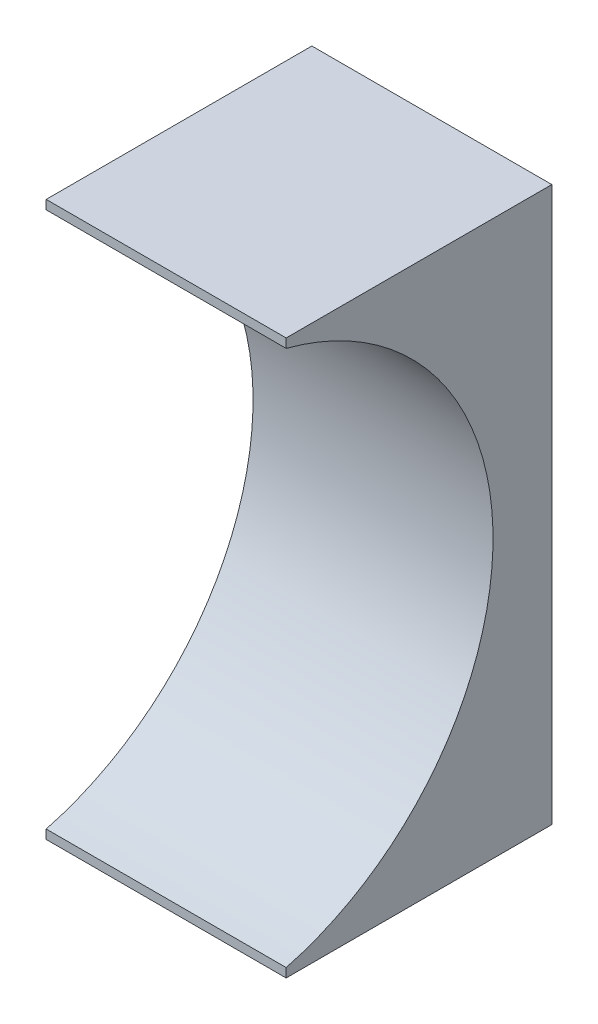
ISO-10303-21;
HEADER;
FILE_DESCRIPTION(('STEP AP214'),'2;1');
FILE_NAME('part.step','',(''),(''),'','','');
FILE_SCHEMA(('AUTOMOTIVE_DESIGN { 1 0 10303 214 1 1 1 1 }'));
ENDSEC;
DATA;
#1=APPLICATION_CONTEXT('core data for automotive mechanical design processes');
#2=APPLICATION_PROTOCOL_DEFINITION('international standard','automotive_design',2000,#1);
#3=PRODUCT_CONTEXT('',#1,'mechanical');
#4=PRODUCT('Part','Part','',(#3));
#5=PRODUCT_RELATED_PRODUCT_CATEGORY('part','',(#4));
#6=PRODUCT_DEFINITION_FORMATION('','',#4);
#7=PRODUCT_DEFINITION_CONTEXT('part definition',#1,'design');
#8=PRODUCT_DEFINITION('design','',#6,#7);
#9=PRODUCT_DEFINITION_SHAPE('','',#8);
#10=(LENGTH_UNIT() NAMED_UNIT(*) SI_UNIT(.MILLI.,.METRE.));
#11=(NAMED_UNIT(*) PLANE_ANGLE_UNIT() SI_UNIT($,.RADIAN.));
#12=(NAMED_UNIT(*) SI_UNIT($,.STERADIAN.) SOLID_ANGLE_UNIT());
#13=UNCERTAINTY_MEASURE_WITH_UNIT(LENGTH_MEASURE(1.E-05),#10,'distance_accuracy_value','');
#14=(GEOMETRIC_REPRESENTATION_CONTEXT(3) GLOBAL_UNCERTAINTY_ASSIGNED_CONTEXT((#13)) GLOBAL_UNIT_ASSIGNED_CONTEXT((#10,
#11,#12)) REPRESENTATION_CONTEXT('',''));
#15=CARTESIAN_POINT('',(0.,0.,0.));
#16=DIRECTION('',(0.,0.,1.));
#17=DIRECTION('',(1.,0.,0.));
#18=AXIS2_PLACEMENT_3D('',#15,#16,#17);
#19=CARTESIAN_POINT('',(20.,0.,0.));
#20=DIRECTION('',(-1.,0.,0.));
#21=DIRECTION('',(0.,0.,1.));
#22=AXIS2_PLACEMENT_3D('',#19,#20,#21);
#23=CYLINDRICAL_SURFACE('',#22,23.1);
#24=DIRECTION('',(-1.,0.,0.));
#25=VECTOR('',#24,1.);
#26=CARTESIAN_POINT('',(20.,22.345151804564,-5.85697796060321));
#27=LINE('',#26,#25);
#28=CARTESIAN_POINT('',(0.,22.345151804564,-5.85697796060321));
#29=VERTEX_POINT('',#28);
#30=CARTESIAN_POINT('',(20.,22.345151804564,-5.85697796060321));
#31=VERTEX_POINT('',#30);
#32=EDGE_CURVE('E138',#29,#31,#27,.F.);
#33=ORIENTED_EDGE('',*,*,#32,.F.);
#34=CARTESIAN_POINT('',(0.,0.,0.));
#35=DIRECTION('',(-1.,0.,0.));
#36=DIRECTION('',(0.,0.,-1.));
#37=AXIS2_PLACEMENT_3D('',#34,#35,#36);
#38=CIRCLE('',#37,23.1);
#39=CARTESIAN_POINT('',(0.,-22.345151804564,-5.85697796060321));
#40=VERTEX_POINT('',#39);
#41=EDGE_CURVE('E133',#29,#40,#38,.T.);
#42=ORIENTED_EDGE('',*,*,#41,.T.);
#43=DIRECTION('',(-1.,0.,0.));
#44=VECTOR('',#43,1.);
#45=CARTESIAN_POINT('',(20.,-22.345151804564,-5.85697796060321));
#46=LINE('',#45,#44);
#47=CARTESIAN_POINT('',(20.,-22.345151804564,-5.85697796060321));
#48=VERTEX_POINT('',#47);
#49=EDGE_CURVE('E67',#48,#40,#46,.T.);
#50=ORIENTED_EDGE('',*,*,#49,.F.);
#51=CARTESIAN_POINT('',(20.,0.,0.));
#52=DIRECTION('',(-1.,0.,0.));
#53=DIRECTION('',(0.,0.,-1.));
#54=AXIS2_PLACEMENT_3D('',#51,#52,#53);
#55=CIRCLE('',#54,23.1);
#56=EDGE_CURVE('E112',#31,#48,#55,.T.);
#57=ORIENTED_EDGE('',*,*,#56,.F.);
#58=EDGE_LOOP('',(#33,#42,#50,#57));
#59=FACE_BOUND('',#58,.T.);
#60=ADVANCED_FACE('F45',(#59),#23,.F.);
#61=CARTESIAN_POINT('',(20.,-23.1,0.));
#62=DIRECTION('',(0.,1.,0.));
#63=DIRECTION('',(0.,0.,1.));
#64=AXIS2_PLACEMENT_3D('',#61,#62,#63);
#65=PLANE('',#64);
#66=DIRECTION('',(1.,0.,0.));
#67=VECTOR('',#66,1.);
#68=CARTESIAN_POINT('',(0.,-23.1,-5.85697796060321));
#69=LINE('',#68,#67);
#70=CARTESIAN_POINT('',(0.,-23.1,-5.85697796060321));
#71=VERTEX_POINT('',#70);
#72=CARTESIAN_POINT('',(20.,-23.1,-5.85697796060321));
#73=VERTEX_POINT('',#72);
#74=EDGE_CURVE('E95',#71,#73,#69,.T.);
#75=ORIENTED_EDGE('',*,*,#74,.F.);
#76=DIRECTION('',(0.,0.,-1.));
#77=VECTOR('',#76,1.);
#78=CARTESIAN_POINT('',(0.,-23.1,0.));
#79=LINE('',#78,#77);
#80=CARTESIAN_POINT('',(0.,-23.1,-28.));
#81=VERTEX_POINT('',#80);
#82=EDGE_CURVE('E137',#71,#81,#79,.T.);
#83=ORIENTED_EDGE('',*,*,#82,.T.);
#84=DIRECTION('',(-1.,0.,0.));
#85=VECTOR('',#84,1.);
#86=CARTESIAN_POINT('',(20.,-23.1,-28.));
#87=LINE('',#86,#85);
#88=CARTESIAN_POINT('',(20.,-23.1,-28.));
#89=VERTEX_POINT('',#88);
#90=EDGE_CURVE('E53',#89,#81,#87,.T.);
#91=ORIENTED_EDGE('',*,*,#90,.F.);
#92=DIRECTION('',(0.,0.,-1.));
#93=VECTOR('',#92,1.);
#94=CARTESIAN_POINT('',(20.,-23.1,0.));
#95=LINE('',#94,#93);
#96=EDGE_CURVE('E108',#73,#89,#95,.T.);
#97=ORIENTED_EDGE('',*,*,#96,.F.);
#98=EDGE_LOOP('',(#75,#83,#91,#97));
#99=FACE_BOUND('',#98,.T.);
#100=ADVANCED_FACE('F116',(#99),#65,.F.);
#101=CARTESIAN_POINT('',(20.,23.1,0.));
#102=DIRECTION('',(0.,-1.,0.));
#103=DIRECTION('',(0.,0.,-1.));
#104=AXIS2_PLACEMENT_3D('',#101,#102,#103);
#105=PLANE('',#104);
#106=DIRECTION('',(1.,0.,0.));
#107=VECTOR('',#106,1.);
#108=CARTESIAN_POINT('',(0.,23.1,-5.85697796060321));
#109=LINE('',#108,#107);
#110=CARTESIAN_POINT('',(0.,23.1,-5.85697796060321));
#111=VERTEX_POINT('',#110);
#112=CARTESIAN_POINT('',(20.,23.1,-5.85697796060321));
#113=VERTEX_POINT('',#112);
#114=EDGE_CURVE('E60',#111,#113,#109,.T.);
#115=ORIENTED_EDGE('',*,*,#114,.T.);
#116=DIRECTION('',(0.,0.,1.));
#117=VECTOR('',#116,1.);
#118=CARTESIAN_POINT('',(20.,23.1,0.));
#119=LINE('',#118,#117);
#120=CARTESIAN_POINT('',(20.,23.1,-28.));
#121=VERTEX_POINT('',#120);
#122=EDGE_CURVE('E124',#121,#113,#119,.T.);
#123=ORIENTED_EDGE('',*,*,#122,.F.);
#124=DIRECTION('',(-1.,0.,0.));
#125=VECTOR('',#124,1.);
#126=CARTESIAN_POINT('',(20.,23.1,-28.));
#127=LINE('',#126,#125);
#128=CARTESIAN_POINT('',(0.,23.1,-28.));
#129=VERTEX_POINT('',#128);
#130=EDGE_CURVE('E132',#121,#129,#127,.T.);
#131=ORIENTED_EDGE('',*,*,#130,.T.);
#132=DIRECTION('',(0.,0.,1.));
#133=VECTOR('',#132,1.);
#134=CARTESIAN_POINT('',(0.,23.1,0.));
#135=LINE('',#134,#133);
#136=EDGE_CURVE('E126',#129,#111,#135,.T.);
#137=ORIENTED_EDGE('',*,*,#136,.T.);
#138=EDGE_LOOP('',(#115,#123,#131,#137));
#139=FACE_BOUND('',#138,.T.);
#140=ADVANCED_FACE('F160',(#139),#105,.F.);
#141=CARTESIAN_POINT('',(20.,0.,0.));
#142=DIRECTION('',(1.,0.,0.));
#143=DIRECTION('',(0.,0.,-1.));
#144=AXIS2_PLACEMENT_3D('',#141,#142,#143);
#145=PLANE('',#144);
#146=ORIENTED_EDGE('',*,*,#122,.T.);
#147=DIRECTION('',(0.,-1.,0.));
#148=VECTOR('',#147,1.);
#149=CARTESIAN_POINT('',(20.,23.1,-5.85697796060321));
#150=LINE('',#149,#148);
#151=EDGE_CURVE('E114',#113,#31,#150,.T.);
#152=ORIENTED_EDGE('',*,*,#151,.T.);
#153=ORIENTED_EDGE('',*,*,#56,.T.);
#154=EDGE_CURVE('E98',#48,#73,#150,.T.);
#155=ORIENTED_EDGE('',*,*,#154,.T.);
#156=ORIENTED_EDGE('',*,*,#96,.T.);
#157=DIRECTION('',(0.,1.,0.));
#158=VECTOR('',#157,1.);
#159=CARTESIAN_POINT('',(20.,-23.1,-28.));
#160=LINE('',#159,#158);
#161=EDGE_CURVE('E120',#89,#121,#160,.T.);
#162=ORIENTED_EDGE('',*,*,#161,.T.);
#163=EDGE_LOOP('',(#146,#152,#153,#155,#156,#162));
#164=FACE_BOUND('',#163,.T.);
#165=ADVANCED_FACE('F107',(#164),#145,.T.);
#166=CARTESIAN_POINT('',(0.,0.,0.));
#167=DIRECTION('',(1.,0.,0.));
#168=DIRECTION('',(0.,0.,-1.));
#169=AXIS2_PLACEMENT_3D('',#166,#167,#168);
#170=PLANE('',#169);
#171=DIRECTION('',(0.,-1.,0.));
#172=VECTOR('',#171,1.);
#173=CARTESIAN_POINT('',(0.,23.1,-5.85697796060321));
#174=LINE('',#173,#172);
#175=EDGE_CURVE('E158',#111,#29,#174,.T.);
#176=ORIENTED_EDGE('',*,*,#175,.F.);
#177=ORIENTED_EDGE('',*,*,#136,.F.);
#178=DIRECTION('',(0.,1.,0.));
#179=VECTOR('',#178,1.);
#180=CARTESIAN_POINT('',(0.,-23.1,-28.));
#181=LINE('',#180,#179);
#182=EDGE_CURVE('E141',#81,#129,#181,.T.);
#183=ORIENTED_EDGE('',*,*,#182,.F.);
#184=ORIENTED_EDGE('',*,*,#82,.F.);
#185=DIRECTION('',(0.,-1.,0.));
#186=VECTOR('',#185,1.);
#187=CARTESIAN_POINT('',(0.,0.,-5.85697796060321));
#188=LINE('',#187,#186);
#189=EDGE_CURVE('E12',#40,#71,#188,.T.);
#190=ORIENTED_EDGE('',*,*,#189,.F.);
#191=ORIENTED_EDGE('',*,*,#41,.F.);
#192=EDGE_LOOP('',(#176,#177,#183,#184,#190,#191));
#193=FACE_BOUND('',#192,.T.);
#194=ADVANCED_FACE('F156',(#193),#170,.F.);
#195=CARTESIAN_POINT('',(20.,-23.1,-28.));
#196=DIRECTION('',(0.,0.,1.));
#197=DIRECTION('',(1.,0.,0.));
#198=AXIS2_PLACEMENT_3D('',#195,#196,#197);
#199=PLANE('',#198);
#200=ORIENTED_EDGE('',*,*,#182,.T.);
#201=ORIENTED_EDGE('',*,*,#130,.F.);
#202=ORIENTED_EDGE('',*,*,#161,.F.);
#203=ORIENTED_EDGE('',*,*,#90,.T.);
#204=EDGE_LOOP('',(#200,#201,#202,#203));
#205=FACE_BOUND('',#204,.T.);
#206=ADVANCED_FACE('F152',(#205),#199,.F.);
#207=CARTESIAN_POINT('',(0.,23.1,-5.85697796060321));
#208=DIRECTION('',(0.,0.,1.));
#209=DIRECTION('',(1.,0.,0.));
#210=AXIS2_PLACEMENT_3D('',#207,#208,#209);
#211=PLANE('',#210);
#212=ORIENTED_EDGE('',*,*,#49,.T.);
#213=ORIENTED_EDGE('',*,*,#189,.T.);
#214=ORIENTED_EDGE('',*,*,#74,.T.);
#215=ORIENTED_EDGE('',*,*,#154,.F.);
#216=EDGE_LOOP('',(#212,#213,#214,#215));
#217=FACE_BOUND('',#216,.T.);
#218=ADVANCED_FACE('F97',(#217),#211,.T.);
#219=ORIENTED_EDGE('',*,*,#32,.T.);
#220=ORIENTED_EDGE('',*,*,#151,.F.);
#221=ORIENTED_EDGE('',*,*,#114,.F.);
#222=ORIENTED_EDGE('',*,*,#175,.T.);
#223=EDGE_LOOP('',(#219,#220,#221,#222));
#224=FACE_BOUND('',#223,.T.);
#225=ADVANCED_FACE('F172',(#224),#211,.T.);
#226=CLOSED_SHELL('',(#60,#100,#140,#165,#194,#206,#218,#225));
#227=MANIFOLD_SOLID_BREP('B2',#226);
#228=ADVANCED_BREP_SHAPE_REPRESENTATION('',(#18,#227),#14);
#229=SHAPE_DEFINITION_REPRESENTATION(#9,#228);
ENDSEC;
END-ISO-10303-21;
